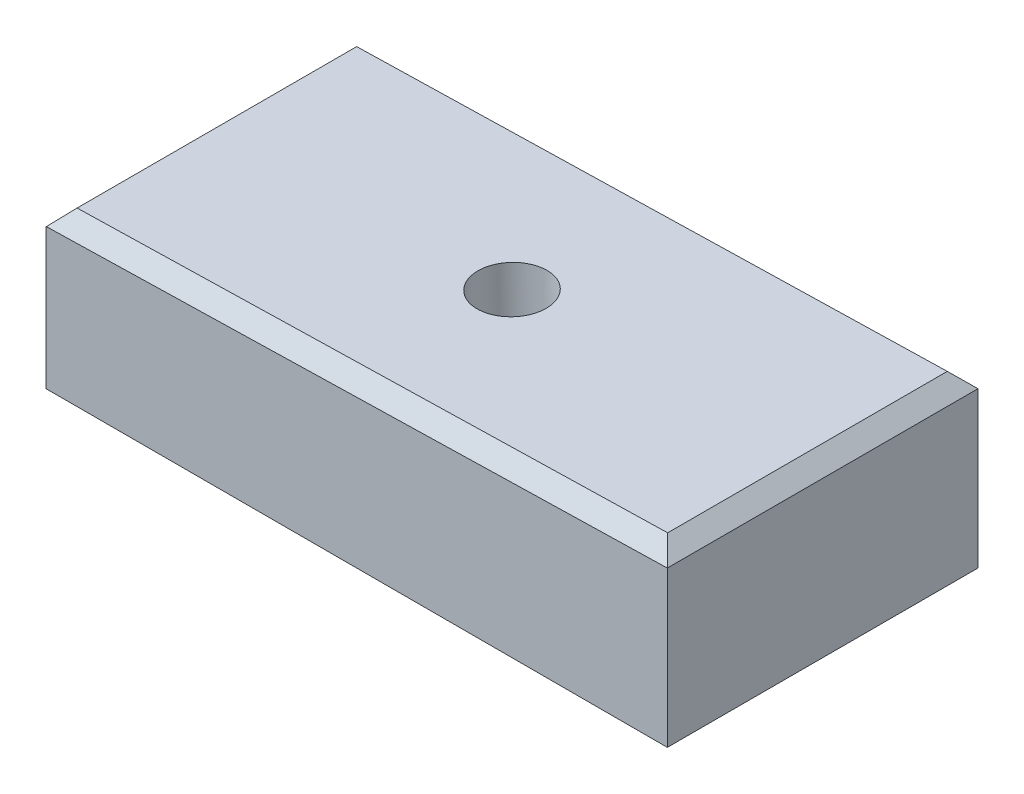
ISO-10303-21;
HEADER;
FILE_DESCRIPTION(('STEP AP214'),'2;1');
FILE_NAME('part.step','',(''),(''),'','','');
FILE_SCHEMA(('AUTOMOTIVE_DESIGN { 1 0 10303 214 1 1 1 1 }'));
ENDSEC;
DATA;
#1=APPLICATION_CONTEXT('core data for automotive mechanical design processes');
#2=APPLICATION_PROTOCOL_DEFINITION('international standard','automotive_design',2000,#1);
#3=PRODUCT_CONTEXT('',#1,'mechanical');
#4=PRODUCT('Part','Part','',(#3));
#5=PRODUCT_RELATED_PRODUCT_CATEGORY('part','',(#4));
#6=PRODUCT_DEFINITION_FORMATION('','',#4);
#7=PRODUCT_DEFINITION_CONTEXT('part definition',#1,'design');
#8=PRODUCT_DEFINITION('design','',#6,#7);
#9=PRODUCT_DEFINITION_SHAPE('','',#8);
#10=(LENGTH_UNIT() NAMED_UNIT(*) SI_UNIT(.MILLI.,.METRE.));
#11=(NAMED_UNIT(*) PLANE_ANGLE_UNIT() SI_UNIT($,.RADIAN.));
#12=(NAMED_UNIT(*) SI_UNIT($,.STERADIAN.) SOLID_ANGLE_UNIT());
#13=UNCERTAINTY_MEASURE_WITH_UNIT(LENGTH_MEASURE(1.E-05),#10,'distance_accuracy_value','');
#14=(GEOMETRIC_REPRESENTATION_CONTEXT(3) GLOBAL_UNCERTAINTY_ASSIGNED_CONTEXT((#13)) GLOBAL_UNIT_ASSIGNED_CONTEXT((#10,
#11,#12)) REPRESENTATION_CONTEXT('',''));
#15=CARTESIAN_POINT('',(0.,0.,0.));
#16=DIRECTION('',(0.,0.,1.));
#17=DIRECTION('',(1.,0.,0.));
#18=AXIS2_PLACEMENT_3D('',#15,#16,#17);
#19=CARTESIAN_POINT('',(0.,0.,-20.));
#20=DIRECTION('',(1.,0.,0.));
#21=DIRECTION('',(0.,0.,-1.));
#22=AXIS2_PLACEMENT_3D('',#19,#20,#21);
#23=PLANE('',#22);
#24=DIRECTION('',(0.,1.,0.));
#25=VECTOR('',#24,1.);
#26=CARTESIAN_POINT('',(0.,0.,-20.));
#27=LINE('',#26,#25);
#28=CARTESIAN_POINT('',(0.,1.00000000000001,-20.));
#29=VERTEX_POINT('',#28);
#30=CARTESIAN_POINT('',(0.,10.9997169484198,-20.));
#31=VERTEX_POINT('',#30);
#32=EDGE_CURVE('E306',#29,#31,#27,.T.);
#33=ORIENTED_EDGE('',*,*,#32,.T.);
#34=DIRECTION('',(0.,-0.707206833790886,-0.707006714423187));
#35=VECTOR('',#34,1.);
#36=CARTESIAN_POINT('',(0.,5.49830195089751,-25.4998582539529));
#37=LINE('',#36,#35);
#38=CARTESIAN_POINT('',(0.,11.,-19.9997170285154));
#39=VERTEX_POINT('',#38);
#40=EDGE_CURVE('E178',#31,#39,#37,.F.);
#41=ORIENTED_EDGE('',*,*,#40,.T.);
#42=DIRECTION('',(0.,0.,1.));
#43=VECTOR('',#42,1.);
#44=CARTESIAN_POINT('',(0.,11.,-20.));
#45=LINE('',#44,#43);
#46=CARTESIAN_POINT('',(0.,11.,-0.000282971484636546));
#47=VERTEX_POINT('',#46);
#48=EDGE_CURVE('E176',#39,#47,#45,.T.);
#49=ORIENTED_EDGE('',*,*,#48,.T.);
#50=DIRECTION('',(0.,-0.707206833790891,0.707006714423182));
#51=VECTOR('',#50,1.);
#52=CARTESIAN_POINT('',(0.,15.4983015504198,-4.49731163083636));
#53=LINE('',#52,#51);
#54=CARTESIAN_POINT('',(0.,10.9997169484198,0.));
#55=VERTEX_POINT('',#54);
#56=EDGE_CURVE('E174',#47,#55,#53,.T.);
#57=ORIENTED_EDGE('',*,*,#56,.T.);
#58=DIRECTION('',(0.,1.,0.));
#59=VECTOR('',#58,1.);
#60=CARTESIAN_POINT('',(0.,0.,0.));
#61=LINE('',#60,#59);
#62=CARTESIAN_POINT('',(0.,1.00000000000001,0.));
#63=VERTEX_POINT('',#62);
#64=EDGE_CURVE('E307',#63,#55,#61,.T.);
#65=ORIENTED_EDGE('',*,*,#64,.F.);
#66=DIRECTION('',(0.,0.,-1.));
#67=VECTOR('',#66,1.);
#68=CARTESIAN_POINT('',(0.,1.00000000000001,-20.));
#69=LINE('',#68,#67);
#70=EDGE_CURVE('E171',#63,#29,#69,.T.);
#71=ORIENTED_EDGE('',*,*,#70,.T.);
#72=EDGE_LOOP('',(#33,#41,#49,#57,#65,#71));
#73=FACE_BOUND('',#72,.T.);
#74=ADVANCED_FACE('F43',(#73),#23,.T.);
#75=CARTESIAN_POINT('',(-40.,0.,-20.));
#76=DIRECTION('',(0.,-1.,0.));
#77=DIRECTION('',(0.,0.,-1.));
#78=AXIS2_PLACEMENT_3D('',#75,#76,#77);
#79=PLANE('',#78);
#80=CARTESIAN_POINT('',(-27.2276282278752,0.,-10.));
#81=CARTESIAN_POINT('',(-27.2276282278752,0.,-10.4893735255628));
#82=CARTESIAN_POINT('',(-27.1794174954509,0.,-10.9787267941624));
#83=CARTESIAN_POINT('',(-26.9884193710516,0.,-11.9386674951442));
#84=CARTESIAN_POINT('',(-26.8456398851888,0.,-12.4092151920642));
#85=CARTESIAN_POINT('',(-26.4709835871981,0.,-13.3134595601045));
#86=CARTESIAN_POINT('',(-26.2391222834667,0.,-13.7471188012385));
#87=CARTESIAN_POINT('',(-25.6952056433069,0.,-14.5609172323795));
#88=CARTESIAN_POINT('',(-25.3831728215797,0.,-14.9410227362896));
#89=CARTESIAN_POINT('',(-24.6908982507003,0.,-15.6331014132059));
#90=CARTESIAN_POINT('',(-24.3106851573262,0.,-15.9450459385426));
#91=CARTESIAN_POINT('',(-23.4966563792542,0.,-16.4888086658026));
#92=CARTESIAN_POINT('',(-23.0628743901855,0.,-16.7206043593974));
#93=CARTESIAN_POINT('',(-22.1583740743496,0.,-17.0951546403384));
#94=CARTESIAN_POINT('',(-21.6876931881585,0.,-17.2378937236788));
#95=CARTESIAN_POINT('',(-20.7274807744467,0.,-17.4288378010547));
#96=CARTESIAN_POINT('',(-20.2379889936287,0.,-17.4770348912167));
#97=CARTESIAN_POINT('',(-19.2589649066063,0.,-17.4770348912167));
#98=CARTESIAN_POINT('',(-18.7694731257884,0.,-17.4288378010547));
#99=CARTESIAN_POINT('',(-17.8092607120765,0.,-17.2378937236788));
#100=CARTESIAN_POINT('',(-17.3385798258854,0.,-17.0951546403385));
#101=CARTESIAN_POINT('',(-16.4340795100495,0.,-16.7206043593974));
#102=CARTESIAN_POINT('',(-16.0002975209809,0.,-16.4888086658026));
#103=CARTESIAN_POINT('',(-15.1862687429089,0.,-15.9450459385425));
#104=CARTESIAN_POINT('',(-14.8060556495348,0.,-15.6331014132059));
#105=CARTESIAN_POINT('',(-14.1137810786554,0.,-14.9410227362896));
#106=CARTESIAN_POINT('',(-13.8017482569282,0.,-14.5609172323795));
#107=CARTESIAN_POINT('',(-13.2578316167684,0.,-13.7471188012385));
#108=CARTESIAN_POINT('',(-13.0259703130369,0.,-13.3134595601045));
#109=CARTESIAN_POINT('',(-12.6513140150463,0.,-12.4092151920642));
#110=CARTESIAN_POINT('',(-12.5085345291834,0.,-11.9386674951442));
#111=CARTESIAN_POINT('',(-12.3175364047842,0.,-10.9787267941624));
#112=CARTESIAN_POINT('',(-12.2693256723599,0.,-10.4893735255628));
#113=CARTESIAN_POINT('',(-12.2693256723599,0.,-9.51062647443725));
#114=CARTESIAN_POINT('',(-12.3175364047842,0.,-9.02127320583764));
#115=CARTESIAN_POINT('',(-12.5085345291834,0.,-8.06133250485578));
#116=CARTESIAN_POINT('',(-12.6513140150463,0.,-7.5907848079358));
#117=CARTESIAN_POINT('',(-13.0259703130369,0.,-6.68654043989551));
#118=CARTESIAN_POINT('',(-13.2578316167684,0.,-6.2528811987615));
#119=CARTESIAN_POINT('',(-13.8017482569282,0.,-5.43908276762055));
#120=CARTESIAN_POINT('',(-14.1137810786554,0.,-5.05897726371037));
#121=CARTESIAN_POINT('',(-14.8060556495348,0.,-4.36689858679408));
#122=CARTESIAN_POINT('',(-15.1862687429088,0.,-4.05495406145746));
#123=CARTESIAN_POINT('',(-16.0002975209809,0.,-3.51119133419738));
#124=CARTESIAN_POINT('',(-16.4340795100495,0.,-3.27939564060265));
#125=CARTESIAN_POINT('',(-17.3385798258854,0.,-2.90484535966156));
#126=CARTESIAN_POINT('',(-17.8092607120765,0.,-2.76210627632123));
#127=CARTESIAN_POINT('',(-18.7694731257884,0.,-2.57116219894529));
#128=CARTESIAN_POINT('',(-19.2589649066063,0.,-2.52296510878326));
#129=CARTESIAN_POINT('',(-20.2379889936287,0.,-2.52296510878326));
#130=CARTESIAN_POINT('',(-20.7274807744467,0.,-2.57116219894529));
#131=CARTESIAN_POINT('',(-21.6876931881585,0.,-2.76210627632122));
#132=CARTESIAN_POINT('',(-22.1583740743496,0.,-2.90484535966155));
#133=CARTESIAN_POINT('',(-23.0628743901855,0.,-3.27939564060265));
#134=CARTESIAN_POINT('',(-23.4966563792542,0.,-3.51119133419738));
#135=CARTESIAN_POINT('',(-24.3106851573262,0.,-4.05495406145745));
#136=CARTESIAN_POINT('',(-24.6908982507003,0.,-4.36689858679406));
#137=CARTESIAN_POINT('',(-25.3831728215797,0.,-5.05897726371036));
#138=CARTESIAN_POINT('',(-25.6952056433069,0.,-5.43908276762054));
#139=CARTESIAN_POINT('',(-26.2391222834667,0.,-6.25288119876149));
#140=CARTESIAN_POINT('',(-26.4709835871981,0.,-6.68654043989549));
#141=CARTESIAN_POINT('',(-26.8456398851888,0.,-7.59078480793578));
#142=CARTESIAN_POINT('',(-26.9884193710516,0.,-8.06133250485576));
#143=CARTESIAN_POINT('',(-27.1794174954508,0.,-9.02127320583763));
#144=CARTESIAN_POINT('',(-27.2276282278752,0.,-9.51062647443724));
#145=CARTESIAN_POINT('',(-27.2276282278752,0.,-10.));
#146=B_SPLINE_CURVE_WITH_KNOTS('',3,(#80,#81,#82,#83,#84,#85,#86,#87,#88,#89,#90,#91,#92,#93,
#94,#95,#96,#97,#98,#99,#100,#101,#102,#103,#104,#105,#106,#107,#108,#109,#110,#111,#112,#113,
#114,#115,#116,#117,#118,#119,#120,#121,#122,#123,#124,#125,#126,#127,#128,#129,#130,#131,#132,
#133,#134,#135,#136,#137,#138,#139,#140,#141,#142,#143,#144,#145),.UNSPECIFIED.,.T.,.F.,(4,2,2,
2,2,2,2,2,2,2,2,2,2,2,2,2,2,2,2,2,2,2,2,2,2,2,2,2,2,2,2,2,4),(0.,0.196349540849362,
0.392699081698724,0.589048622548086,0.785398163397448,0.98174770424681,1.17809724509617,
1.37444678594553,1.5707963267949,1.76714586764426,1.96349540849362,2.15984494934298,
2.35619449019234,2.55254403104171,2.74889357189107,2.94524311274043,3.14159265358979,
3.33794219443916,3.53429173528852,3.73064127613788,3.92699081698724,4.1233403578366,
4.31968989868597,4.51603943953533,4.71238898038469,4.90873852123405,5.10508806208341,
5.30143760293278,5.49778714378214,5.6941366846315,5.89048622548086,6.08683576633022,
6.28318530717959),.UNSPECIFIED.);
#147=CARTESIAN_POINT('',(-27.2276282278752,0.,-10.));
#148=VERTEX_POINT('',#147);
#149=EDGE_CURVE('E11',#148,#148,#146,.F.);
#150=ORIENTED_EDGE('',*,*,#149,.T.);
#151=EDGE_LOOP('',(#150));
#152=FACE_BOUND('',#151,.T.);
#153=DIRECTION('',(1.,0.,0.));
#154=VECTOR('',#153,1.);
#155=CARTESIAN_POINT('',(-40.,0.,-19.));
#156=LINE('',#155,#154);
#157=CARTESIAN_POINT('',(-39.,0.,-19.));
#158=VERTEX_POINT('',#157);
#159=CARTESIAN_POINT('',(-1.00000000000001,0.,-19.));
#160=VERTEX_POINT('',#159);
#161=EDGE_CURVE('E60',#158,#160,#156,.T.);
#162=ORIENTED_EDGE('',*,*,#161,.T.);
#163=DIRECTION('',(0.,0.,1.));
#164=VECTOR('',#163,1.);
#165=CARTESIAN_POINT('',(-1.00000000000001,0.,-20.));
#166=LINE('',#165,#164);
#167=CARTESIAN_POINT('',(-1.00000000000001,0.,-1.00000000000001));
#168=VERTEX_POINT('',#167);
#169=EDGE_CURVE('E53',#160,#168,#166,.T.);
#170=ORIENTED_EDGE('',*,*,#169,.T.);
#171=DIRECTION('',(-1.,0.,0.));
#172=VECTOR('',#171,1.);
#173=CARTESIAN_POINT('',(-40.,0.,-1.00000000000001));
#174=LINE('',#173,#172);
#175=CARTESIAN_POINT('',(-39.,0.,-1.00000000000001));
#176=VERTEX_POINT('',#175);
#177=EDGE_CURVE('E189',#168,#176,#174,.T.);
#178=ORIENTED_EDGE('',*,*,#177,.T.);
#179=DIRECTION('',(0.,0.,-1.));
#180=VECTOR('',#179,1.);
#181=CARTESIAN_POINT('',(-39.,0.,-20.));
#182=LINE('',#181,#180);
#183=EDGE_CURVE('E65',#176,#158,#182,.T.);
#184=ORIENTED_EDGE('',*,*,#183,.T.);
#185=EDGE_LOOP('',(#162,#170,#178,#184));
#186=FACE_BOUND('',#185,.T.);
#187=ADVANCED_FACE('F215',(#152,#186),#79,.T.);
#188=CARTESIAN_POINT('',(-40.,11.0482157567785,-20.));
#189=DIRECTION('',(-1.,0.,0.));
#190=DIRECTION('',(0.,-1.,0.));
#191=AXIS2_PLACEMENT_3D('',#188,#189,#190);
#192=PLANE('',#191);
#193=DIRECTION('',(0.,-1.,0.));
#194=VECTOR('',#193,1.);
#195=CARTESIAN_POINT('',(-40.,11.0482157567785,0.));
#196=LINE('',#195,#194);
#197=CARTESIAN_POINT('',(-40.,10.0235512160879,0.));
#198=VERTEX_POINT('',#197);
#199=CARTESIAN_POINT('',(-40.,1.00000000000001,0.));
#200=VERTEX_POINT('',#199);
#201=EDGE_CURVE('E302',#198,#200,#196,.T.);
#202=ORIENTED_EDGE('',*,*,#201,.F.);
#203=DIRECTION('',(0.,0.,-1.));
#204=VECTOR('',#203,1.);
#205=CARTESIAN_POINT('',(-40.,10.0235512160879,-20.));
#206=LINE('',#205,#204);
#207=CARTESIAN_POINT('',(-40.,10.0235512160879,-20.));
#208=VERTEX_POINT('',#207);
#209=EDGE_CURVE('E162',#198,#208,#206,.T.);
#210=ORIENTED_EDGE('',*,*,#209,.T.);
#211=DIRECTION('',(0.,-1.,0.));
#212=VECTOR('',#211,1.);
#213=CARTESIAN_POINT('',(-40.,11.0482157567785,-20.));
#214=LINE('',#213,#212);
#215=CARTESIAN_POINT('',(-40.,1.00000000000001,-20.));
#216=VERTEX_POINT('',#215);
#217=EDGE_CURVE('E144',#208,#216,#214,.T.);
#218=ORIENTED_EDGE('',*,*,#217,.T.);
#219=DIRECTION('',(0.,0.,1.));
#220=VECTOR('',#219,1.);
#221=CARTESIAN_POINT('',(-40.,1.00000000000001,-20.));
#222=LINE('',#221,#220);
#223=EDGE_CURVE('E160',#216,#200,#222,.T.);
#224=ORIENTED_EDGE('',*,*,#223,.T.);
#225=EDGE_LOOP('',(#202,#210,#218,#224));
#226=FACE_BOUND('',#225,.T.);
#227=ADVANCED_FACE('F219',(#226),#192,.T.);
#228=CARTESIAN_POINT('',(0.,12.,-20.));
#229=DIRECTION('',(-0.0237878728855297,0.99971702851536,0.));
#230=DIRECTION('',(-0.99971702851536,-0.0237878728855297,0.));
#231=AXIS2_PLACEMENT_3D('',#228,#229,#230);
#232=PLANE('',#231);
#233=DIRECTION('',(-0.99971702851536,-0.0237878728855297,0.));
#234=VECTOR('',#233,1.);
#235=CARTESIAN_POINT('',(0.,12.,-19.));
#236=LINE('',#235,#234);
#237=CARTESIAN_POINT('',(-0.976758418203015,11.976758418203,-19.));
#238=VERTEX_POINT('',#237);
#239=CARTESIAN_POINT('',(-39.0002829714846,11.072003629664,-19.));
#240=VERTEX_POINT('',#239);
#241=EDGE_CURVE('E149',#238,#240,#236,.T.);
#242=ORIENTED_EDGE('',*,*,#241,.T.);
#243=DIRECTION('',(0.,0.,1.));
#244=VECTOR('',#243,1.);
#245=CARTESIAN_POINT('',(-39.0002829714846,11.072003629664,-20.));
#246=LINE('',#245,#244);
#247=CARTESIAN_POINT('',(-39.0002829714846,11.072003629664,-1.));
#248=VERTEX_POINT('',#247);
#249=EDGE_CURVE('E128',#240,#248,#246,.T.);
#250=ORIENTED_EDGE('',*,*,#249,.T.);
#251=DIRECTION('',(0.99971702851536,0.0237878728855297,0.));
#252=VECTOR('',#251,1.);
#253=CARTESIAN_POINT('',(0.,12.,-1.));
#254=LINE('',#253,#252);
#255=CARTESIAN_POINT('',(-0.976758418203015,11.976758418203,-1.));
#256=VERTEX_POINT('',#255);
#257=EDGE_CURVE('E136',#248,#256,#254,.T.);
#258=ORIENTED_EDGE('',*,*,#257,.T.);
#259=DIRECTION('',(0.,0.,-1.));
#260=VECTOR('',#259,1.);
#261=CARTESIAN_POINT('',(-0.976758418203015,11.976758418203,-20.));
#262=LINE('',#261,#260);
#263=EDGE_CURVE('E143',#256,#238,#262,.T.);
#264=ORIENTED_EDGE('',*,*,#263,.T.);
#265=EDGE_LOOP('',(#242,#250,#258,#264));
#266=FACE_BOUND('',#265,.T.);
#267=CARTESIAN_POINT('',(-20.,11.5241078783892,-10.));
#268=DIRECTION('',(-0.0237878728855297,0.99971702851536,0.));
#269=DIRECTION('',(-0.99971702851536,-0.0237878728855297,0.));
#270=AXIS2_PLACEMENT_3D('',#267,#268,#269);
#271=CIRCLE('',#270,2.2);
#272=CARTESIAN_POINT('',(-22.1993774627338,11.4717745580411,-10.));
#273=VERTEX_POINT('',#272);
#274=EDGE_CURVE('E311',#273,#273,#271,.T.);
#275=ORIENTED_EDGE('',*,*,#274,.F.);
#276=EDGE_LOOP('',(#275));
#277=FACE_BOUND('',#276,.T.);
#278=ADVANCED_FACE('F146',(#266,#277),#232,.T.);
#279=CARTESIAN_POINT('',(0.,0.,-20.));
#280=DIRECTION('',(0.,0.,-1.));
#281=DIRECTION('',(-1.,0.,0.));
#282=AXIS2_PLACEMENT_3D('',#279,#280,#281);
#283=PLANE('',#282);
#284=ORIENTED_EDGE('',*,*,#217,.F.);
#285=DIRECTION('',(-0.690086123903515,-0.723727256358238,0.));
#286=VECTOR('',#285,1.);
#287=CARTESIAN_POINT('',(-25.9573493161533,24.7507696014244,-20.));
#288=LINE('',#287,#286);
#289=CARTESIAN_POINT('',(-39.9762121271145,10.0484987282631,-20.));
#290=VERTEX_POINT('',#289);
#291=EDGE_CURVE('E169',#208,#290,#288,.F.);
#292=ORIENTED_EDGE('',*,*,#291,.T.);
#293=DIRECTION('',(0.99971702851536,0.0237878728855297,0.));
#294=VECTOR('',#293,1.);
#295=CARTESIAN_POINT('',(-0.261585826264345,10.9934926167276,-20.));
#296=LINE('',#295,#294);
#297=EDGE_CURVE('E167',#290,#31,#296,.T.);
#298=ORIENTED_EDGE('',*,*,#297,.T.);
#299=ORIENTED_EDGE('',*,*,#32,.F.);
#300=DIRECTION('',(-1.,0.,0.));
#301=VECTOR('',#300,1.);
#302=CARTESIAN_POINT('',(0.,1.00000000000001,-20.));
#303=LINE('',#302,#301);
#304=EDGE_CURVE('E165',#29,#216,#303,.T.);
#305=ORIENTED_EDGE('',*,*,#304,.T.);
#306=EDGE_LOOP('',(#284,#292,#298,#299,#305));
#307=FACE_BOUND('',#306,.T.);
#308=ADVANCED_FACE('F208',(#307),#283,.T.);
#309=CARTESIAN_POINT('',(0.,0.,0.));
#310=DIRECTION('',(0.,0.,-1.));
#311=DIRECTION('',(-1.,0.,0.));
#312=AXIS2_PLACEMENT_3D('',#309,#310,#311);
#313=PLANE('',#312);
#314=DIRECTION('',(-0.99971702851536,-0.0237878728855297,0.));
#315=VECTOR('',#314,1.);
#316=CARTESIAN_POINT('',(-39.9762121271145,10.0484987282631,0.));
#317=LINE('',#316,#315);
#318=CARTESIAN_POINT('',(-39.9762121271145,10.0484987282631,0.));
#319=VERTEX_POINT('',#318);
#320=EDGE_CURVE('E153',#55,#319,#317,.T.);
#321=ORIENTED_EDGE('',*,*,#320,.T.);
#322=DIRECTION('',(0.690086123903515,0.723727256358238,0.));
#323=VECTOR('',#322,1.);
#324=CARTESIAN_POINT('',(-39.0002829714846,11.072003629664,0.));
#325=LINE('',#324,#323);
#326=EDGE_CURVE('E130',#319,#198,#325,.F.);
#327=ORIENTED_EDGE('',*,*,#326,.T.);
#328=ORIENTED_EDGE('',*,*,#201,.T.);
#329=DIRECTION('',(1.,0.,0.));
#330=VECTOR('',#329,1.);
#331=CARTESIAN_POINT('',(0.,1.00000000000001,0.));
#332=LINE('',#331,#330);
#333=EDGE_CURVE('E151',#200,#63,#332,.T.);
#334=ORIENTED_EDGE('',*,*,#333,.T.);
#335=ORIENTED_EDGE('',*,*,#64,.T.);
#336=EDGE_LOOP('',(#321,#327,#328,#334,#335));
#337=FACE_BOUND('',#336,.T.);
#338=ADVANCED_FACE('F206',(#337),#313,.F.);
#339=CARTESIAN_POINT('',(-19.7146263008501,-0.469101766853755,-10.));
#340=DIRECTION('',(-0.0237878728855297,0.99971702851536,0.));
#341=DIRECTION('',(-0.99971702851536,-0.0237878728855297,0.));
#342=AXIS2_PLACEMENT_3D('',#339,#340,#341);
#343=CYLINDRICAL_SURFACE('',#342,2.2);
#344=CARTESIAN_POINT('',(-19.9286363813434,8.52495679284315,-10.));
#345=DIRECTION('',(-0.0237878728855297,0.99971702851536,0.));
#346=DIRECTION('',(-0.99971702851536,-0.0237878728855297,0.));
#347=AXIS2_PLACEMENT_3D('',#344,#345,#346);
#348=CIRCLE('',#347,2.2);
#349=CARTESIAN_POINT('',(-22.1280138440772,8.47262347249498,-10.));
#350=VERTEX_POINT('',#349);
#351=EDGE_CURVE('E315',#350,#350,#348,.F.);
#352=ORIENTED_EDGE('',*,*,#351,.T.);
#353=EDGE_LOOP('',(#352));
#354=FACE_BOUND('',#353,.T.);
#355=ORIENTED_EDGE('',*,*,#274,.T.);
#356=EDGE_LOOP('',(#355));
#357=FACE_BOUND('',#356,.T.);
#358=ADVANCED_FACE('F203',(#354,#357),#343,.F.);
#359=CARTESIAN_POINT('',(-19.9286363813434,8.52495679284315,-10.));
#360=DIRECTION('',(-0.0237878728855297,0.99971702851536,0.));
#361=DIRECTION('',(-0.99971702851536,-0.0237878728855297,0.));
#362=AXIS2_PLACEMENT_3D('',#359,#360,#361);
#363=PLANE('',#362);
#364=CARTESIAN_POINT('',(-19.9286363813434,8.52495679284315,-10.));
#365=DIRECTION('',(-0.0237878728855297,0.99971702851536,0.));
#366=DIRECTION('',(-0.99971702851536,-0.0237878728855297,0.));
#367=AXIS2_PLACEMENT_3D('',#364,#365,#366);
#368=CIRCLE('',#367,6.5);
#369=CARTESIAN_POINT('',(-26.4267970666932,8.3703356190872,-10.));
#370=VERTEX_POINT('',#369);
#371=EDGE_CURVE('E238',#370,#370,#368,.T.);
#372=ORIENTED_EDGE('',*,*,#371,.F.);
#373=EDGE_LOOP('',(#372));
#374=FACE_BOUND('',#373,.T.);
#375=ORIENTED_EDGE('',*,*,#351,.F.);
#376=EDGE_LOOP('',(#375));
#377=FACE_BOUND('',#376,.T.);
#378=ADVANCED_FACE('F202',(#374,#377),#363,.F.);
#379=CARTESIAN_POINT('',(-19.7146263008501,-0.469101766853757,-10.));
#380=DIRECTION('',(-0.0237878728855297,0.99971702851536,0.));
#381=DIRECTION('',(-0.99971702851536,-0.0237878728855297,0.));
#382=AXIS2_PLACEMENT_3D('',#379,#380,#381);
#383=CYLINDRICAL_SURFACE('',#382,6.5);
#384=CARTESIAN_POINT('',(-26.2508698096722,0.976758418203023,-10.));
#385=CARTESIAN_POINT('',(-26.2508698096722,0.976758418203023,-9.57457361608732));
#386=CARTESIAN_POINT('',(-26.2089552781127,0.976608602583641,-9.14916484213183));
#387=CARTESIAN_POINT('',(-26.0429010302229,0.976015072867976,-8.31466097165849));
#388=CARTESIAN_POINT('',(-25.9187681874863,0.975571383340064,-7.90560041831392));
#389=CARTESIAN_POINT('',(-25.5930410633289,0.974407132922853,-7.1195149609399));
#390=CARTESIAN_POINT('',(-25.3914602649469,0.973686620226144,-6.74252259586735));
#391=CARTESIAN_POINT('',(-24.9185777752336,0.971996390598003,-6.03506437487781));
#392=CARTESIAN_POINT('',(-24.64729565824,0.971026743631363,-5.70462780324724));
#393=CARTESIAN_POINT('',(-24.0454304118551,0.968875489369009,-5.10298404132762));
#394=CARTESIAN_POINT('',(-23.7148721958691,0.967693971121581,-4.83180175527595));
#395=CARTESIAN_POINT('',(-23.0071535367015,0.965164363719879,-4.35909328479097));
#396=CARTESIAN_POINT('',(-22.630022388584,0.963816379275309,-4.15758666749053));
#397=CARTESIAN_POINT('',(-21.8436475478123,0.961005630128088,-3.83197940986273));
#398=CARTESIAN_POINT('',(-21.434436406088,0.959542981772621,-3.70789224761041));
#399=CARTESIAN_POINT('',(-20.5996253278388,0.956559106393321,-3.54189910714759));
#400=CARTESIAN_POINT('',(-20.1740599471961,0.955038002882997,-3.5));
#401=CARTESIAN_POINT('',(-19.322893953039,0.951995669929067,-3.5));
#402=CARTESIAN_POINT('',(-18.8973285723962,0.950474566418743,-3.5418991071476));
#403=CARTESIAN_POINT('',(-18.0625174941471,0.947490691039442,-3.70789224761041));
#404=CARTESIAN_POINT('',(-17.6533063524228,0.946028042683976,-3.83197940986274));
#405=CARTESIAN_POINT('',(-16.866931511651,0.943217293536754,-4.15758666749054));
#406=CARTESIAN_POINT('',(-16.4898003635336,0.941869309092184,-4.35909328479097));
#407=CARTESIAN_POINT('',(-15.7820817043659,0.939339701690482,-4.83180175527596));
#408=CARTESIAN_POINT('',(-15.4515234883799,0.938158183443054,-5.10298404132763));
#409=CARTESIAN_POINT('',(-14.849658241995,0.9360069291807,-5.70462780324725));
#410=CARTESIAN_POINT('',(-14.5783761250015,0.93503728221406,-6.03506437487782));
#411=CARTESIAN_POINT('',(-14.1054936352881,0.933347052585919,-6.74252259586737));
#412=CARTESIAN_POINT('',(-13.9039128369062,0.93262653988921,-7.11951496093991));
#413=CARTESIAN_POINT('',(-13.5781857127488,0.931462289471999,-7.90560041831394));
#414=CARTESIAN_POINT('',(-13.4540528700122,0.931018599944087,-8.31466097165851));
#415=CARTESIAN_POINT('',(-13.2879986221224,0.930425070228423,-9.14916484213184));
#416=CARTESIAN_POINT('',(-13.2460840905629,0.93027525460904,-9.57457361608732));
#417=CARTESIAN_POINT('',(-13.2460840905629,0.93027525460904,-10.4254263839127));
#418=CARTESIAN_POINT('',(-13.2879986221224,0.930425070228423,-10.8508351578682));
#419=CARTESIAN_POINT('',(-13.4540528700122,0.931018599944087,-11.6853390283415));
#420=CARTESIAN_POINT('',(-13.5781857127488,0.931462289471999,-12.0943995816861));
#421=CARTESIAN_POINT('',(-13.9039128369062,0.93262653988921,-12.8804850390601));
#422=CARTESIAN_POINT('',(-14.1054936352882,0.933347052585919,-13.2574774041326));
#423=CARTESIAN_POINT('',(-14.5783761250015,0.935037282214061,-13.9649356251222));
#424=CARTESIAN_POINT('',(-14.849658241995,0.9360069291807,-14.2953721967527));
#425=CARTESIAN_POINT('',(-15.4515234883799,0.938158183443055,-14.8970159586724));
#426=CARTESIAN_POINT('',(-15.7820817043659,0.939339701690482,-15.168198244724));
#427=CARTESIAN_POINT('',(-16.4898003635336,0.941869309092184,-15.640906715209));
#428=CARTESIAN_POINT('',(-16.866931511651,0.943217293536755,-15.8424133325095));
#429=CARTESIAN_POINT('',(-17.6533063524228,0.946028042683976,-16.1680205901373));
#430=CARTESIAN_POINT('',(-18.0625174941471,0.947490691039442,-16.2921077523896));
#431=CARTESIAN_POINT('',(-18.8973285723962,0.950474566418742,-16.4581008928524));
#432=CARTESIAN_POINT('',(-19.322893953039,0.951995669929067,-16.5));
#433=CARTESIAN_POINT('',(-20.1740599471961,0.955038002882996,-16.5));
#434=CARTESIAN_POINT('',(-20.5996253278388,0.956559106393321,-16.4581008928524));
#435=CARTESIAN_POINT('',(-21.434436406088,0.959542981772621,-16.2921077523896));
#436=CARTESIAN_POINT('',(-21.8436475478123,0.961005630128088,-16.1680205901373));
#437=CARTESIAN_POINT('',(-22.630022388584,0.963816379275309,-15.8424133325095));
#438=CARTESIAN_POINT('',(-23.0071535367015,0.96516436371988,-15.640906715209));
#439=CARTESIAN_POINT('',(-23.7148721958691,0.967693971121581,-15.1681982447241));
#440=CARTESIAN_POINT('',(-24.0454304118552,0.968875489369009,-14.8970159586724));
#441=CARTESIAN_POINT('',(-24.64729565824,0.971026743631363,-14.2953721967528));
#442=CARTESIAN_POINT('',(-24.9185777752336,0.971996390598003,-13.9649356251222));
#443=CARTESIAN_POINT('',(-25.3914602649469,0.973686620226145,-13.2574774041327));
#444=CARTESIAN_POINT('',(-25.5930410633289,0.974407132922854,-12.8804850390601));
#445=CARTESIAN_POINT('',(-25.9187681874863,0.975571383340064,-12.0943995816861));
#446=CARTESIAN_POINT('',(-26.0429010302229,0.976015072867976,-11.6853390283415));
#447=CARTESIAN_POINT('',(-26.2089552781127,0.97660860258364,-10.8508351578682));
#448=CARTESIAN_POINT('',(-26.2508698096721,0.976758418203023,-10.4254263839127));
#449=CARTESIAN_POINT('',(-26.2508698096722,0.976758418203023,-10.));
#450=B_SPLINE_CURVE_WITH_KNOTS('',3,(#384,#385,#386,#387,#388,#389,#390,#391,#392,#393,#394,
#395,#396,#397,#398,#399,#400,#401,#402,#403,#404,#405,#406,#407,#408,#409,#410,#411,#412,#413,
#414,#415,#416,#417,#418,#419,#420,#421,#422,#423,#424,#425,#426,#427,#428,#429,#430,#431,#432,
#433,#434,#435,#436,#437,#438,#439,#440,#441,#442,#443,#444,#445,#446,#447,#448,#449),
.UNSPECIFIED.,.T.,.F.,(4,2,2,2,2,2,2,2,2,2,2,2,2,2,2,2,2,2,2,2,2,2,2,2,2,2,2,2,2,2,2,2,4),(0.,
0.196349540849362,0.392699081698725,0.589048622548086,0.785398163397448,0.981747704246811,
1.17809724509617,1.37444678594553,1.5707963267949,1.76714586764426,1.96349540849362,
2.15984494934298,2.35619449019234,2.55254403104171,2.74889357189107,2.94524311274043,
3.14159265358979,3.33794219443916,3.53429173528852,3.73064127613788,3.92699081698724,
4.1233403578366,4.31968989868597,4.51603943953533,4.71238898038469,4.90873852123405,
5.10508806208341,5.30143760293278,5.49778714378214,5.6941366846315,5.89048622548086,
6.08683576633022,6.28318530717959),.UNSPECIFIED.);
#451=CARTESIAN_POINT('',(-26.2508698096722,0.976758418203023,-10.));
#452=VERTEX_POINT('',#451);
#453=EDGE_CURVE('E180',#452,#452,#450,.F.);
#454=ORIENTED_EDGE('',*,*,#453,.T.);
#455=EDGE_LOOP('',(#454));
#456=FACE_BOUND('',#455,.T.);
#457=ORIENTED_EDGE('',*,*,#371,.T.);
#458=EDGE_LOOP('',(#457));
#459=FACE_BOUND('',#458,.T.);
#460=ADVANCED_FACE('F191',(#456,#459),#383,.F.);
#461=CARTESIAN_POINT('',(0.,11.,-20.));
#462=DIRECTION('',(-0.707106781186549,-0.707106781186546,0.));
#463=DIRECTION('',(0.,0.,1.));
#464=AXIS2_PLACEMENT_3D('',#461,#462,#463);
#465=PLANE('',#464);
#466=DIRECTION('',(0.572827296585596,-0.572827296585599,0.586291545711578));
#467=VECTOR('',#466,1.);
#468=CARTESIAN_POINT('',(-0.0836041388541058,11.0836041388541,-0.0858522173792129));
#469=LINE('',#468,#467);
#470=EDGE_CURVE('E140',#47,#256,#469,.F.);
#471=ORIENTED_EDGE('',*,*,#470,.F.);
#472=ORIENTED_EDGE('',*,*,#48,.F.);
#473=DIRECTION('',(-0.572827296585593,0.572827296585596,0.586291545711584));
#474=VECTOR('',#473,1.);
#475=CARTESIAN_POINT('',(9.50342190143467E-05,10.999904965781,-19.9998142965043));
#476=LINE('',#475,#474);
#477=EDGE_CURVE('E235',#238,#39,#476,.F.);
#478=ORIENTED_EDGE('',*,*,#477,.F.);
#479=ORIENTED_EDGE('',*,*,#263,.F.);
#480=EDGE_LOOP('',(#471,#472,#478,#479));
#481=FACE_BOUND('',#480,.T.);
#482=ADVANCED_FACE('F201',(#481),#465,.F.);
#483=CARTESIAN_POINT('',(0.,12.,-19.));
#484=DIRECTION('',(0.0168205662273617,-0.706906690130879,0.707106781186545));
#485=DIRECTION('',(-0.99971702851536,-0.0237878728855297,0.));
#486=AXIS2_PLACEMENT_3D('',#483,#484,#485);
#487=PLANE('',#486);
#488=ORIENTED_EDGE('',*,*,#40,.F.);
#489=ORIENTED_EDGE('',*,*,#297,.F.);
#490=DIRECTION('',(0.563452960712886,0.590920830340703,0.577350269189629));
#491=VECTOR('',#490,1.);
#492=CARTESIAN_POINT('',(-26.3095207711018,24.3814300769375,-5.99622597893108));
#493=LINE('',#492,#491);
#494=EDGE_CURVE('E133',#240,#290,#493,.F.);
#495=ORIENTED_EDGE('',*,*,#494,.F.);
#496=ORIENTED_EDGE('',*,*,#241,.F.);
#497=ORIENTED_EDGE('',*,*,#477,.T.);
#498=EDGE_LOOP('',(#488,#489,#495,#496,#497));
#499=FACE_BOUND('',#498,.T.);
#500=ADVANCED_FACE('F322',(#499),#487,.F.);
#501=CARTESIAN_POINT('',(-0.261585826264345,10.9934926167276,0.));
#502=DIRECTION('',(-0.0168205662273616,0.706906690130874,0.70710678118655));
#503=DIRECTION('',(0.99971702851536,0.0237878728855297,0.));
#504=AXIS2_PLACEMENT_3D('',#501,#502,#503);
#505=PLANE('',#504);
#506=ORIENTED_EDGE('',*,*,#470,.T.);
#507=ORIENTED_EDGE('',*,*,#257,.F.);
#508=DIRECTION('',(0.563452960712889,0.590920830340706,-0.577350269189623));
#509=VECTOR('',#508,1.);
#510=CARTESIAN_POINT('',(-27.0530013229859,23.6017054580347,-13.2419558628601));
#511=LINE('',#510,#509);
#512=EDGE_CURVE('E123',#319,#248,#511,.T.);
#513=ORIENTED_EDGE('',*,*,#512,.F.);
#514=ORIENTED_EDGE('',*,*,#320,.F.);
#515=ORIENTED_EDGE('',*,*,#56,.F.);
#516=EDGE_LOOP('',(#506,#507,#513,#514,#515));
#517=FACE_BOUND('',#516,.T.);
#518=ADVANCED_FACE('F137',(#517),#505,.T.);
#519=CARTESIAN_POINT('',(-39.0002829714846,11.072003629664,-20.));
#520=DIRECTION('',(0.723727256358238,-0.690086123903515,0.));
#521=DIRECTION('',(0.,0.,1.));
#522=AXIS2_PLACEMENT_3D('',#519,#520,#521);
#523=PLANE('',#522);
#524=ORIENTED_EDGE('',*,*,#291,.F.);
#525=ORIENTED_EDGE('',*,*,#209,.F.);
#526=ORIENTED_EDGE('',*,*,#326,.F.);
#527=ORIENTED_EDGE('',*,*,#512,.T.);
#528=ORIENTED_EDGE('',*,*,#249,.F.);
#529=ORIENTED_EDGE('',*,*,#494,.T.);
#530=EDGE_LOOP('',(#524,#525,#526,#527,#528,#529));
#531=FACE_BOUND('',#530,.T.);
#532=ADVANCED_FACE('F125',(#531),#523,.F.);
#533=CARTESIAN_POINT('',(-26.2508698096722,0.976758418203023,-10.));
#534=CARTESIAN_POINT('',(-26.2508698096721,0.976758418203023,-10.4254263839127));
#535=CARTESIAN_POINT('',(-26.2089552781127,0.97660860258364,-10.8508351578682));
#536=CARTESIAN_POINT('',(-26.0429010302229,0.976015072867976,-11.6853390283415));
#537=CARTESIAN_POINT('',(-25.9187681874863,0.975571383340064,-12.0943995816861));
#538=CARTESIAN_POINT('',(-25.5930410633289,0.974407132922854,-12.8804850390601));
#539=CARTESIAN_POINT('',(-25.3914602649469,0.973686620226145,-13.2574774041327));
#540=CARTESIAN_POINT('',(-24.9185777752336,0.971996390598003,-13.9649356251222));
#541=CARTESIAN_POINT('',(-24.64729565824,0.971026743631363,-14.2953721967528));
#542=CARTESIAN_POINT('',(-24.0454304118552,0.968875489369009,-14.8970159586724));
#543=CARTESIAN_POINT('',(-23.7148721958691,0.967693971121581,-15.1681982447241));
#544=CARTESIAN_POINT('',(-23.0071535367015,0.96516436371988,-15.640906715209));
#545=CARTESIAN_POINT('',(-22.630022388584,0.963816379275309,-15.8424133325095));
#546=CARTESIAN_POINT('',(-21.8436475478123,0.961005630128088,-16.1680205901373));
#547=CARTESIAN_POINT('',(-21.434436406088,0.959542981772621,-16.2921077523896));
#548=CARTESIAN_POINT('',(-20.5996253278388,0.956559106393321,-16.4581008928524));
#549=CARTESIAN_POINT('',(-20.1740599471961,0.955038002882996,-16.5));
#550=CARTESIAN_POINT('',(-19.322893953039,0.951995669929067,-16.5));
#551=CARTESIAN_POINT('',(-18.8973285723962,0.950474566418742,-16.4581008928524));
#552=CARTESIAN_POINT('',(-18.0625174941471,0.947490691039442,-16.2921077523896));
#553=CARTESIAN_POINT('',(-17.6533063524228,0.946028042683976,-16.1680205901373));
#554=CARTESIAN_POINT('',(-16.866931511651,0.943217293536755,-15.8424133325095));
#555=CARTESIAN_POINT('',(-16.4898003635336,0.941869309092184,-15.640906715209));
#556=CARTESIAN_POINT('',(-15.7820817043659,0.939339701690482,-15.168198244724));
#557=CARTESIAN_POINT('',(-15.4515234883799,0.938158183443055,-14.8970159586724));
#558=CARTESIAN_POINT('',(-14.849658241995,0.9360069291807,-14.2953721967527));
#559=CARTESIAN_POINT('',(-14.5783761250015,0.935037282214061,-13.9649356251222));
#560=CARTESIAN_POINT('',(-14.1054936352882,0.933347052585919,-13.2574774041326));
#561=CARTESIAN_POINT('',(-13.9039128369062,0.93262653988921,-12.8804850390601));
#562=CARTESIAN_POINT('',(-13.5781857127488,0.931462289471999,-12.0943995816861));
#563=CARTESIAN_POINT('',(-13.4540528700122,0.931018599944087,-11.6853390283415));
#564=CARTESIAN_POINT('',(-13.2879986221224,0.930425070228423,-10.8508351578682));
#565=CARTESIAN_POINT('',(-13.2460840905629,0.93027525460904,-10.4254263839127));
#566=CARTESIAN_POINT('',(-13.2460840905629,0.93027525460904,-9.57457361608732));
#567=CARTESIAN_POINT('',(-13.2879986221224,0.930425070228423,-9.14916484213184));
#568=CARTESIAN_POINT('',(-13.4540528700122,0.931018599944087,-8.31466097165851));
#569=CARTESIAN_POINT('',(-13.5781857127488,0.931462289471999,-7.90560041831394));
#570=CARTESIAN_POINT('',(-13.9039128369062,0.93262653988921,-7.11951496093991));
#571=CARTESIAN_POINT('',(-14.1054936352881,0.933347052585919,-6.74252259586737));
#572=CARTESIAN_POINT('',(-14.5783761250015,0.93503728221406,-6.03506437487782));
#573=CARTESIAN_POINT('',(-14.849658241995,0.9360069291807,-5.70462780324725));
#574=CARTESIAN_POINT('',(-15.4515234883799,0.938158183443054,-5.10298404132763));
#575=CARTESIAN_POINT('',(-15.7820817043659,0.939339701690482,-4.83180175527596));
#576=CARTESIAN_POINT('',(-16.4898003635336,0.941869309092184,-4.35909328479097));
#577=CARTESIAN_POINT('',(-16.866931511651,0.943217293536754,-4.15758666749054));
#578=CARTESIAN_POINT('',(-17.6533063524228,0.946028042683976,-3.83197940986274));
#579=CARTESIAN_POINT('',(-18.0625174941471,0.947490691039442,-3.70789224761041));
#580=CARTESIAN_POINT('',(-18.8973285723962,0.950474566418743,-3.5418991071476));
#581=CARTESIAN_POINT('',(-19.322893953039,0.951995669929067,-3.5));
#582=CARTESIAN_POINT('',(-20.1740599471961,0.955038002882997,-3.5));
#583=CARTESIAN_POINT('',(-20.5996253278388,0.956559106393321,-3.54189910714759));
#584=CARTESIAN_POINT('',(-21.434436406088,0.959542981772621,-3.70789224761041));
#585=CARTESIAN_POINT('',(-21.8436475478123,0.961005630128088,-3.83197940986273));
#586=CARTESIAN_POINT('',(-22.630022388584,0.963816379275309,-4.15758666749053));
#587=CARTESIAN_POINT('',(-23.0071535367015,0.965164363719879,-4.35909328479097));
#588=CARTESIAN_POINT('',(-23.7148721958691,0.967693971121581,-4.83180175527595));
#589=CARTESIAN_POINT('',(-24.0454304118551,0.968875489369009,-5.10298404132762));
#590=CARTESIAN_POINT('',(-24.64729565824,0.971026743631363,-5.70462780324724));
#591=CARTESIAN_POINT('',(-24.9185777752336,0.971996390598003,-6.03506437487781));
#592=CARTESIAN_POINT('',(-25.3914602649469,0.973686620226144,-6.74252259586735));
#593=CARTESIAN_POINT('',(-25.5930410633289,0.974407132922853,-7.1195149609399));
#594=CARTESIAN_POINT('',(-25.9187681874863,0.975571383340064,-7.90560041831392));
#595=CARTESIAN_POINT('',(-26.0429010302229,0.976015072867976,-8.31466097165849));
#596=CARTESIAN_POINT('',(-26.2089552781127,0.976608602583641,-9.14916484213183));
#597=CARTESIAN_POINT('',(-26.2508698096722,0.976758418203023,-9.57457361608732));
#598=CARTESIAN_POINT('',(-26.2508698096722,0.976758418203023,-10.));
#599=CARTESIAN_POINT('',(-27.2276282278752,0.,-10.));
#600=CARTESIAN_POINT('',(-27.2276282278752,0.,-10.4893735255628));
#601=CARTESIAN_POINT('',(-27.1794174954509,0.,-10.9787267941624));
#602=CARTESIAN_POINT('',(-26.9884193710516,0.,-11.9386674951442));
#603=CARTESIAN_POINT('',(-26.8456398851888,0.,-12.4092151920642));
#604=CARTESIAN_POINT('',(-26.4709835871981,0.,-13.3134595601045));
#605=CARTESIAN_POINT('',(-26.2391222834667,0.,-13.7471188012385));
#606=CARTESIAN_POINT('',(-25.6952056433069,0.,-14.5609172323795));
#607=CARTESIAN_POINT('',(-25.3831728215797,0.,-14.9410227362896));
#608=CARTESIAN_POINT('',(-24.6908982507003,0.,-15.6331014132059));
#609=CARTESIAN_POINT('',(-24.3106851573262,0.,-15.9450459385426));
#610=CARTESIAN_POINT('',(-23.4966563792542,0.,-16.4888086658026));
#611=CARTESIAN_POINT('',(-23.0628743901855,0.,-16.7206043593974));
#612=CARTESIAN_POINT('',(-22.1583740743496,0.,-17.0951546403384));
#613=CARTESIAN_POINT('',(-21.6876931881585,0.,-17.2378937236788));
#614=CARTESIAN_POINT('',(-20.7274807744467,0.,-17.4288378010547));
#615=CARTESIAN_POINT('',(-20.2379889936287,0.,-17.4770348912167));
#616=CARTESIAN_POINT('',(-19.2589649066063,0.,-17.4770348912167));
#617=CARTESIAN_POINT('',(-18.7694731257884,0.,-17.4288378010547));
#618=CARTESIAN_POINT('',(-17.8092607120765,0.,-17.2378937236788));
#619=CARTESIAN_POINT('',(-17.3385798258854,0.,-17.0951546403385));
#620=CARTESIAN_POINT('',(-16.4340795100495,0.,-16.7206043593974));
#621=CARTESIAN_POINT('',(-16.0002975209809,0.,-16.4888086658026));
#622=CARTESIAN_POINT('',(-15.1862687429089,0.,-15.9450459385426));
#623=CARTESIAN_POINT('',(-14.8060556495348,0.,-15.6331014132059));
#624=CARTESIAN_POINT('',(-14.1137810786554,0.,-14.9410227362896));
#625=CARTESIAN_POINT('',(-13.8017482569282,0.,-14.5609172323795));
#626=CARTESIAN_POINT('',(-13.2578316167684,0.,-13.7471188012385));
#627=CARTESIAN_POINT('',(-13.0259703130369,0.,-13.3134595601045));
#628=CARTESIAN_POINT('',(-12.6513140150463,0.,-12.4092151920642));
#629=CARTESIAN_POINT('',(-12.5085345291834,0.,-11.9386674951442));
#630=CARTESIAN_POINT('',(-12.3175364047842,0.,-10.9787267941624));
#631=CARTESIAN_POINT('',(-12.2693256723599,0.,-10.4893735255628));
#632=CARTESIAN_POINT('',(-12.2693256723599,0.,-9.51062647443725));
#633=CARTESIAN_POINT('',(-12.3175364047842,0.,-9.02127320583764));
#634=CARTESIAN_POINT('',(-12.5085345291834,0.,-8.06133250485578));
#635=CARTESIAN_POINT('',(-12.6513140150463,0.,-7.5907848079358));
#636=CARTESIAN_POINT('',(-13.0259703130369,0.,-6.6865404398955));
#637=CARTESIAN_POINT('',(-13.2578316167684,0.,-6.2528811987615));
#638=CARTESIAN_POINT('',(-13.8017482569282,0.,-5.43908276762055));
#639=CARTESIAN_POINT('',(-14.1137810786554,0.,-5.05897726371037));
#640=CARTESIAN_POINT('',(-14.8060556495348,0.,-4.36689858679407));
#641=CARTESIAN_POINT('',(-15.1862687429088,0.,-4.05495406145746));
#642=CARTESIAN_POINT('',(-16.0002975209809,0.,-3.51119133419738));
#643=CARTESIAN_POINT('',(-16.4340795100495,0.,-3.27939564060265));
#644=CARTESIAN_POINT('',(-17.3385798258854,0.,-2.90484535966155));
#645=CARTESIAN_POINT('',(-17.8092607120765,0.,-2.76210627632122));
#646=CARTESIAN_POINT('',(-18.7694731257884,0.,-2.57116219894528));
#647=CARTESIAN_POINT('',(-19.2589649066063,0.,-2.52296510878326));
#648=CARTESIAN_POINT('',(-20.2379889936287,0.,-2.52296510878326));
#649=CARTESIAN_POINT('',(-20.7274807744467,0.,-2.57116219894528));
#650=CARTESIAN_POINT('',(-21.6876931881585,0.,-2.76210627632122));
#651=CARTESIAN_POINT('',(-22.1583740743496,0.,-2.90484535966155));
#652=CARTESIAN_POINT('',(-23.0628743901855,0.,-3.27939564060264));
#653=CARTESIAN_POINT('',(-23.4966563792542,0.,-3.51119133419738));
#654=CARTESIAN_POINT('',(-24.3106851573262,0.,-4.05495406145745));
#655=CARTESIAN_POINT('',(-24.6908982507003,0.,-4.36689858679406));
#656=CARTESIAN_POINT('',(-25.3831728215797,0.,-5.05897726371036));
#657=CARTESIAN_POINT('',(-25.6952056433069,0.,-5.43908276762054));
#658=CARTESIAN_POINT('',(-26.2391222834667,0.,-6.25288119876148));
#659=CARTESIAN_POINT('',(-26.4709835871981,0.,-6.68654043989549));
#660=CARTESIAN_POINT('',(-26.8456398851888,0.,-7.59078480793578));
#661=CARTESIAN_POINT('',(-26.9884193710516,0.,-8.06133250485575));
#662=CARTESIAN_POINT('',(-27.1794174954509,0.,-9.02127320583763));
#663=CARTESIAN_POINT('',(-27.2276282278752,0.,-9.51062647443724));
#664=CARTESIAN_POINT('',(-27.2276282278752,0.,-10.));
#665=B_SPLINE_SURFACE_WITH_KNOTS('',1,3,((#533,#534,#535,#536,#537,#538,#539,#540,#541,#542,
#543,#544,#545,#546,#547,#548,#549,#550,#551,#552,#553,#554,#555,#556,#557,#558,#559,#560,#561,
#562,#563,#564,#565,#566,#567,#568,#569,#570,#571,#572,#573,#574,#575,#576,#577,#578,#579,#580,
#581,#582,#583,#584,#585,#586,#587,#588,#589,#590,#591,#592,#593,#594,#595,#596,#597,#598),
(#599,#600,#601,#602,#603,#604,#605,#606,#607,#608,#609,#610,#611,#612,#613,#614,#615,#616,#617,
#618,#619,#620,#621,#622,#623,#624,#625,#626,#627,#628,#629,#630,#631,#632,#633,#634,#635,#636,
#637,#638,#639,#640,#641,#642,#643,#644,#645,#646,#647,#648,#649,#650,#651,#652,#653,#654,#655,
#656,#657,#658,#659,#660,#661,#662,#663,#664)),.UNSPECIFIED.,.F.,.T.,.F.,(2,2),(4,2,2,2,2,2,2,2,
2,2,2,2,2,2,2,2,2,2,2,2,2,2,2,2,2,2,2,2,2,2,2,2,4),(0.,1.),(0.,0.196349540849362,
0.392699081698724,0.589048622548086,0.785398163397448,0.98174770424681,1.17809724509617,
1.37444678594553,1.5707963267949,1.76714586764426,1.96349540849362,2.15984494934298,
2.35619449019234,2.55254403104171,2.74889357189107,2.94524311274043,3.14159265358979,
3.33794219443916,3.53429173528852,3.73064127613788,3.92699081698724,4.1233403578366,
4.31968989868597,4.51603943953533,4.71238898038469,4.90873852123405,5.10508806208341,
5.30143760293278,5.49778714378214,5.6941366846315,5.89048622548086,6.08683576633022,
6.28318530717959),.UNSPECIFIED.);
#666=ORIENTED_EDGE('',*,*,#149,.F.);
#667=EDGE_LOOP('',(#666));
#668=FACE_BOUND('',#667,.T.);
#669=ORIENTED_EDGE('',*,*,#453,.F.);
#670=EDGE_LOOP('',(#669));
#671=FACE_BOUND('',#670,.T.);
#672=ADVANCED_FACE('F248',(#668,#671),#665,.T.);
#673=CARTESIAN_POINT('',(-40.,1.00000000000001,-20.));
#674=DIRECTION('',(0.707106781186546,0.707106781186549,0.));
#675=DIRECTION('',(0.,0.,1.));
#676=AXIS2_PLACEMENT_3D('',#673,#674,#675);
#677=PLANE('',#676);
#678=DIRECTION('',(-0.577350269189627,0.577350269189624,0.577350269189628));
#679=VECTOR('',#678,1.);
#680=CARTESIAN_POINT('',(-26.6666666666666,-12.3333333333333,-13.3333333333334));
#681=LINE('',#680,#679);
#682=EDGE_CURVE('E286',#200,#176,#681,.F.);
#683=ORIENTED_EDGE('',*,*,#682,.F.);
#684=ORIENTED_EDGE('',*,*,#223,.F.);
#685=DIRECTION('',(0.577350269189627,-0.577350269189624,0.577350269189628));
#686=VECTOR('',#685,1.);
#687=CARTESIAN_POINT('',(-40.,1.00000000000001,-20.));
#688=LINE('',#687,#686);
#689=EDGE_CURVE('E48',#158,#216,#688,.F.);
#690=ORIENTED_EDGE('',*,*,#689,.F.);
#691=ORIENTED_EDGE('',*,*,#183,.F.);
#692=EDGE_LOOP('',(#683,#684,#690,#691));
#693=FACE_BOUND('',#692,.T.);
#694=ADVANCED_FACE('F46',(#693),#677,.F.);
#695=CARTESIAN_POINT('',(-40.,0.,-19.));
#696=DIRECTION('',(0.,0.70710678118655,0.707106781186545));
#697=DIRECTION('',(1.,0.,0.));
#698=AXIS2_PLACEMENT_3D('',#695,#696,#697);
#699=PLANE('',#698);
#700=ORIENTED_EDGE('',*,*,#689,.T.);
#701=ORIENTED_EDGE('',*,*,#304,.F.);
#702=DIRECTION('',(-0.577350269189627,-0.577350269189623,0.577350269189627));
#703=VECTOR('',#702,1.);
#704=CARTESIAN_POINT('',(-14.0000000000001,-13.,-5.99999999999993));
#705=LINE('',#704,#703);
#706=EDGE_CURVE('E285',#160,#29,#705,.F.);
#707=ORIENTED_EDGE('',*,*,#706,.F.);
#708=ORIENTED_EDGE('',*,*,#161,.F.);
#709=EDGE_LOOP('',(#700,#701,#707,#708));
#710=FACE_BOUND('',#709,.T.);
#711=ADVANCED_FACE('F295',(#710),#699,.F.);
#712=CARTESIAN_POINT('',(0.,1.00000000000001,0.));
#713=DIRECTION('',(0.,-0.70710678118655,0.707106781186545));
#714=DIRECTION('',(-1.,0.,0.));
#715=AXIS2_PLACEMENT_3D('',#712,#713,#714);
#716=PLANE('',#715);
#717=ORIENTED_EDGE('',*,*,#682,.T.);
#718=ORIENTED_EDGE('',*,*,#177,.F.);
#719=DIRECTION('',(-0.577350269189627,-0.577350269189623,-0.577350269189627));
#720=VECTOR('',#719,1.);
#721=CARTESIAN_POINT('',(0.,1.00000000000001,0.));
#722=LINE('',#721,#720);
#723=EDGE_CURVE('E278',#63,#168,#722,.T.);
#724=ORIENTED_EDGE('',*,*,#723,.F.);
#725=ORIENTED_EDGE('',*,*,#333,.F.);
#726=EDGE_LOOP('',(#717,#718,#724,#725));
#727=FACE_BOUND('',#726,.T.);
#728=ADVANCED_FACE('F446',(#727),#716,.T.);
#729=CARTESIAN_POINT('',(-1.00000000000001,0.,-20.));
#730=DIRECTION('',(-0.707106781186545,0.70710678118655,0.));
#731=DIRECTION('',(0.,0.,1.));
#732=AXIS2_PLACEMENT_3D('',#729,#730,#731);
#733=PLANE('',#732);
#734=ORIENTED_EDGE('',*,*,#706,.T.);
#735=ORIENTED_EDGE('',*,*,#70,.F.);
#736=ORIENTED_EDGE('',*,*,#723,.T.);
#737=ORIENTED_EDGE('',*,*,#169,.F.);
#738=EDGE_LOOP('',(#734,#735,#736,#737));
#739=FACE_BOUND('',#738,.T.);
#740=ADVANCED_FACE('F267',(#739),#733,.F.);
#741=CLOSED_SHELL('',(#74,#187,#227,#278,#308,#338,#358,#378,#460,#482,#500,#518,#532,#672,#694,
#711,#728,#740));
#742=MANIFOLD_SOLID_BREP('B2',#741);
#743=ADVANCED_BREP_SHAPE_REPRESENTATION('',(#18,#742),#14);
#744=SHAPE_DEFINITION_REPRESENTATION(#9,#743);
ENDSEC;
END-ISO-10303-21;
